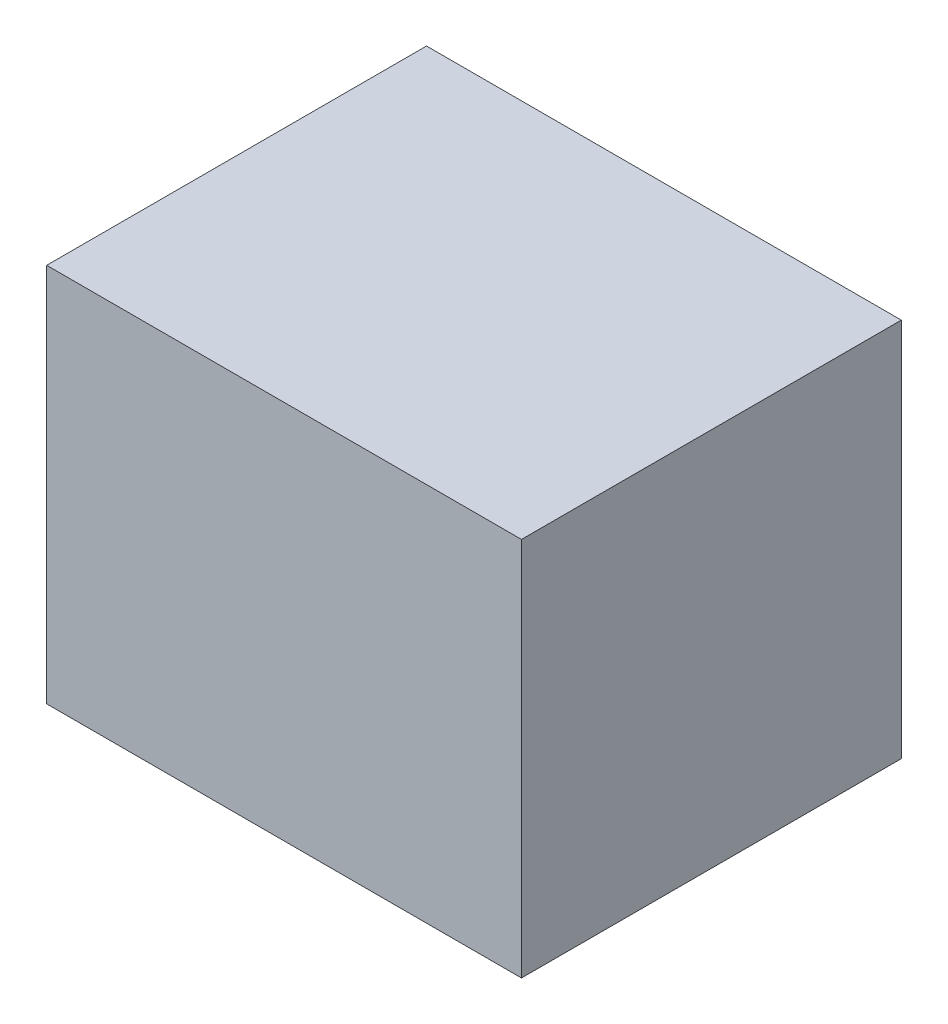
ISO-10303-21;
HEADER;
FILE_DESCRIPTION(('STEP AP214'),'2;1');
FILE_NAME('part.step','',(''),(''),'','','');
FILE_SCHEMA(('AUTOMOTIVE_DESIGN { 1 0 10303 214 1 1 1 1 }'));
ENDSEC;
DATA;
#1=APPLICATION_CONTEXT('core data for automotive mechanical design processes');
#2=APPLICATION_PROTOCOL_DEFINITION('international standard','automotive_design',2000,#1);
#3=PRODUCT_CONTEXT('',#1,'mechanical');
#4=PRODUCT('Part','Part','',(#3));
#5=PRODUCT_RELATED_PRODUCT_CATEGORY('part','',(#4));
#6=PRODUCT_DEFINITION_FORMATION('','',#4);
#7=PRODUCT_DEFINITION_CONTEXT('part definition',#1,'design');
#8=PRODUCT_DEFINITION('design','',#6,#7);
#9=PRODUCT_DEFINITION_SHAPE('','',#8);
#10=(LENGTH_UNIT() NAMED_UNIT(*) SI_UNIT(.MILLI.,.METRE.));
#11=(NAMED_UNIT(*) PLANE_ANGLE_UNIT() SI_UNIT($,.RADIAN.));
#12=(NAMED_UNIT(*) SI_UNIT($,.STERADIAN.) SOLID_ANGLE_UNIT());
#13=UNCERTAINTY_MEASURE_WITH_UNIT(LENGTH_MEASURE(1.E-05),#10,'distance_accuracy_value','');
#14=(GEOMETRIC_REPRESENTATION_CONTEXT(3) GLOBAL_UNCERTAINTY_ASSIGNED_CONTEXT((#13)) GLOBAL_UNIT_ASSIGNED_CONTEXT((#10,
#11,#12)) REPRESENTATION_CONTEXT('',''));
#15=CARTESIAN_POINT('',(0.,0.,0.));
#16=DIRECTION('',(0.,0.,1.));
#17=DIRECTION('',(1.,0.,0.));
#18=AXIS2_PLACEMENT_3D('',#15,#16,#17);
#19=CARTESIAN_POINT('',(-63.5,101.6,50.8));
#20=DIRECTION('',(-1.,0.,0.));
#21=DIRECTION('',(0.,0.,1.));
#22=AXIS2_PLACEMENT_3D('',#19,#20,#21);
#23=PLANE('',#22);
#24=DIRECTION('',(0.,0.,-1.));
#25=VECTOR('',#24,1.);
#26=CARTESIAN_POINT('',(-63.5,0.,50.8));
#27=LINE('',#26,#25);
#28=CARTESIAN_POINT('',(-63.5,0.,50.8));
#29=VERTEX_POINT('',#28);
#30=CARTESIAN_POINT('',(-63.5,0.,-50.8));
#31=VERTEX_POINT('',#30);
#32=EDGE_CURVE('E98',#29,#31,#27,.T.);
#33=ORIENTED_EDGE('',*,*,#32,.F.);
#34=DIRECTION('',(0.,-1.,0.));
#35=VECTOR('',#34,1.);
#36=CARTESIAN_POINT('',(-63.5,101.6,50.8));
#37=LINE('',#36,#35);
#38=CARTESIAN_POINT('',(-63.5,101.6,50.8));
#39=VERTEX_POINT('',#38);
#40=EDGE_CURVE('E11',#39,#29,#37,.T.);
#41=ORIENTED_EDGE('',*,*,#40,.F.);
#42=DIRECTION('',(0.,0.,-1.));
#43=VECTOR('',#42,1.);
#44=CARTESIAN_POINT('',(-63.5,101.6,50.8));
#45=LINE('',#44,#43);
#46=CARTESIAN_POINT('',(-63.5,101.6,-50.8));
#47=VERTEX_POINT('',#46);
#48=EDGE_CURVE('E93',#39,#47,#45,.T.);
#49=ORIENTED_EDGE('',*,*,#48,.T.);
#50=DIRECTION('',(0.,-1.,0.));
#51=VECTOR('',#50,1.);
#52=CARTESIAN_POINT('',(-63.5,101.6,-50.8));
#53=LINE('',#52,#51);
#54=EDGE_CURVE('E36',#47,#31,#53,.T.);
#55=ORIENTED_EDGE('',*,*,#54,.T.);
#56=EDGE_LOOP('',(#33,#41,#49,#55));
#57=FACE_BOUND('',#56,.T.);
#58=ADVANCED_FACE('F33',(#57),#23,.T.);
#59=CARTESIAN_POINT('',(-63.5,101.6,50.8));
#60=DIRECTION('',(0.,0.,-1.));
#61=DIRECTION('',(-1.,0.,0.));
#62=AXIS2_PLACEMENT_3D('',#59,#60,#61);
#63=PLANE('',#62);
#64=DIRECTION('',(1.,0.,0.));
#65=VECTOR('',#64,1.);
#66=CARTESIAN_POINT('',(-63.5,0.,50.8));
#67=LINE('',#66,#65);
#68=CARTESIAN_POINT('',(63.5,0.,50.8));
#69=VERTEX_POINT('',#68);
#70=EDGE_CURVE('E66',#29,#69,#67,.T.);
#71=ORIENTED_EDGE('',*,*,#70,.T.);
#72=DIRECTION('',(0.,-1.,0.));
#73=VECTOR('',#72,1.);
#74=CARTESIAN_POINT('',(63.5,101.6,50.8));
#75=LINE('',#74,#73);
#76=CARTESIAN_POINT('',(63.5,101.6,50.8));
#77=VERTEX_POINT('',#76);
#78=EDGE_CURVE('E42',#77,#69,#75,.T.);
#79=ORIENTED_EDGE('',*,*,#78,.F.);
#80=DIRECTION('',(1.,0.,0.));
#81=VECTOR('',#80,1.);
#82=CARTESIAN_POINT('',(-63.5,101.6,50.8));
#83=LINE('',#82,#81);
#84=EDGE_CURVE('E83',#39,#77,#83,.T.);
#85=ORIENTED_EDGE('',*,*,#84,.F.);
#86=ORIENTED_EDGE('',*,*,#40,.T.);
#87=EDGE_LOOP('',(#71,#79,#85,#86));
#88=FACE_BOUND('',#87,.T.);
#89=ADVANCED_FACE('F108',(#88),#63,.F.);
#90=CARTESIAN_POINT('',(63.5,101.6,50.8));
#91=DIRECTION('',(-1.,0.,0.));
#92=DIRECTION('',(0.,0.,1.));
#93=AXIS2_PLACEMENT_3D('',#90,#91,#92);
#94=PLANE('',#93);
#95=DIRECTION('',(0.,0.,-1.));
#96=VECTOR('',#95,1.);
#97=CARTESIAN_POINT('',(63.5,0.,50.8));
#98=LINE('',#97,#96);
#99=CARTESIAN_POINT('',(63.5,0.,-50.8));
#100=VERTEX_POINT('',#99);
#101=EDGE_CURVE('E90',#69,#100,#98,.T.);
#102=ORIENTED_EDGE('',*,*,#101,.T.);
#103=DIRECTION('',(0.,-1.,0.));
#104=VECTOR('',#103,1.);
#105=CARTESIAN_POINT('',(63.5,101.6,-50.8));
#106=LINE('',#105,#104);
#107=CARTESIAN_POINT('',(63.5,101.6,-50.8));
#108=VERTEX_POINT('',#107);
#109=EDGE_CURVE('E87',#108,#100,#106,.T.);
#110=ORIENTED_EDGE('',*,*,#109,.F.);
#111=DIRECTION('',(0.,0.,-1.));
#112=VECTOR('',#111,1.);
#113=CARTESIAN_POINT('',(63.5,101.6,50.8));
#114=LINE('',#113,#112);
#115=EDGE_CURVE('E78',#77,#108,#114,.T.);
#116=ORIENTED_EDGE('',*,*,#115,.F.);
#117=ORIENTED_EDGE('',*,*,#78,.T.);
#118=EDGE_LOOP('',(#102,#110,#116,#117));
#119=FACE_BOUND('',#118,.T.);
#120=ADVANCED_FACE('F88',(#119),#94,.F.);
#121=CARTESIAN_POINT('',(-63.5,101.6,-50.8));
#122=DIRECTION('',(0.,0.,-1.));
#123=DIRECTION('',(-1.,0.,0.));
#124=AXIS2_PLACEMENT_3D('',#121,#122,#123);
#125=PLANE('',#124);
#126=DIRECTION('',(1.,0.,0.));
#127=VECTOR('',#126,1.);
#128=CARTESIAN_POINT('',(-63.5,0.,-50.8));
#129=LINE('',#128,#127);
#130=EDGE_CURVE('E101',#31,#100,#129,.T.);
#131=ORIENTED_EDGE('',*,*,#130,.F.);
#132=ORIENTED_EDGE('',*,*,#54,.F.);
#133=DIRECTION('',(1.,0.,0.));
#134=VECTOR('',#133,1.);
#135=CARTESIAN_POINT('',(-63.5,101.6,-50.8));
#136=LINE('',#135,#134);
#137=EDGE_CURVE('E82',#47,#108,#136,.T.);
#138=ORIENTED_EDGE('',*,*,#137,.T.);
#139=ORIENTED_EDGE('',*,*,#109,.T.);
#140=EDGE_LOOP('',(#131,#132,#138,#139));
#141=FACE_BOUND('',#140,.T.);
#142=ADVANCED_FACE('F92',(#141),#125,.T.);
#143=CARTESIAN_POINT('',(0.,101.6,0.));
#144=DIRECTION('',(0.,-1.,0.));
#145=DIRECTION('',(0.,0.,-1.));
#146=AXIS2_PLACEMENT_3D('',#143,#144,#145);
#147=PLANE('',#146);
#148=ORIENTED_EDGE('',*,*,#48,.F.);
#149=ORIENTED_EDGE('',*,*,#84,.T.);
#150=ORIENTED_EDGE('',*,*,#115,.T.);
#151=ORIENTED_EDGE('',*,*,#137,.F.);
#152=EDGE_LOOP('',(#148,#149,#150,#151));
#153=FACE_BOUND('',#152,.T.);
#154=ADVANCED_FACE('F81',(#153),#147,.F.);
#155=CARTESIAN_POINT('',(0.,0.,0.));
#156=DIRECTION('',(0.,-1.,0.));
#157=DIRECTION('',(0.,0.,-1.));
#158=AXIS2_PLACEMENT_3D('',#155,#156,#157);
#159=PLANE('',#158);
#160=ORIENTED_EDGE('',*,*,#32,.T.);
#161=ORIENTED_EDGE('',*,*,#130,.T.);
#162=ORIENTED_EDGE('',*,*,#101,.F.);
#163=ORIENTED_EDGE('',*,*,#70,.F.);
#164=EDGE_LOOP('',(#160,#161,#162,#163));
#165=FACE_BOUND('',#164,.T.);
#166=ADVANCED_FACE('F106',(#165),#159,.T.);
#167=CLOSED_SHELL('',(#58,#89,#120,#142,#154,#166));
#168=MANIFOLD_SOLID_BREP('B2',#167);
#169=ADVANCED_BREP_SHAPE_REPRESENTATION('',(#18,#168),#14);
#170=SHAPE_DEFINITION_REPRESENTATION(#9,#169);
ENDSEC;
END-ISO-10303-21;
